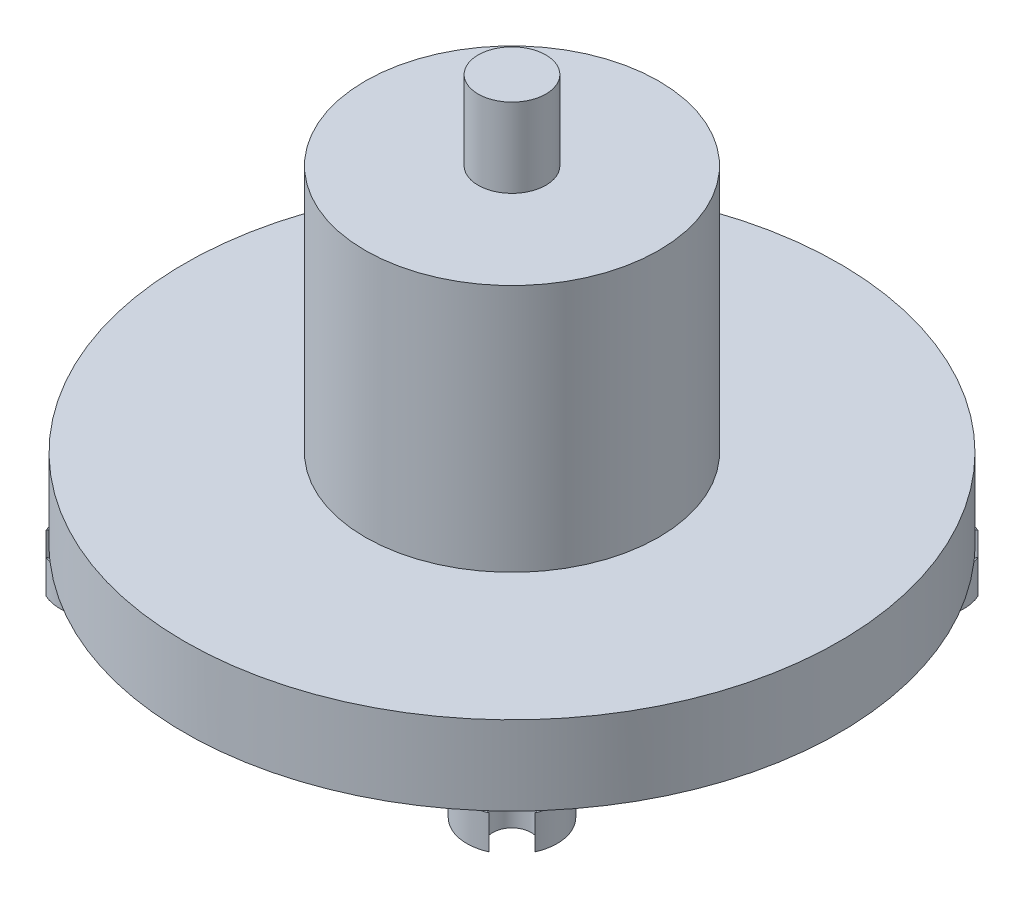
ISO-10303-21;
HEADER;
FILE_DESCRIPTION(('STEP AP214'),'2;1');
FILE_NAME('part.step','',(''),(''),'','','');
FILE_SCHEMA(('AUTOMOTIVE_DESIGN { 1 0 10303 214 1 1 1 1 }'));
ENDSEC;
DATA;
#1=APPLICATION_CONTEXT('core data for automotive mechanical design processes');
#2=APPLICATION_PROTOCOL_DEFINITION('international standard','automotive_design',2000,#1);
#3=PRODUCT_CONTEXT('',#1,'mechanical');
#4=PRODUCT('Part','Part','',(#3));
#5=PRODUCT_RELATED_PRODUCT_CATEGORY('part','',(#4));
#6=PRODUCT_DEFINITION_FORMATION('','',#4);
#7=PRODUCT_DEFINITION_CONTEXT('part definition',#1,'design');
#8=PRODUCT_DEFINITION('design','',#6,#7);
#9=PRODUCT_DEFINITION_SHAPE('','',#8);
#10=(LENGTH_UNIT() NAMED_UNIT(*) SI_UNIT(.MILLI.,.METRE.));
#11=(NAMED_UNIT(*) PLANE_ANGLE_UNIT() SI_UNIT($,.RADIAN.));
#12=(NAMED_UNIT(*) SI_UNIT($,.STERADIAN.) SOLID_ANGLE_UNIT());
#13=UNCERTAINTY_MEASURE_WITH_UNIT(LENGTH_MEASURE(1.E-05),#10,'distance_accuracy_value','');
#14=(GEOMETRIC_REPRESENTATION_CONTEXT(3) GLOBAL_UNCERTAINTY_ASSIGNED_CONTEXT((#13)) GLOBAL_UNIT_ASSIGNED_CONTEXT((#10,
#11,#12)) REPRESENTATION_CONTEXT('',''));
#15=CARTESIAN_POINT('',(0.,0.,0.));
#16=DIRECTION('',(0.,0.,1.));
#17=DIRECTION('',(1.,0.,0.));
#18=AXIS2_PLACEMENT_3D('',#15,#16,#17);
#19=CARTESIAN_POINT('',(-36.,0.,36.));
#20=DIRECTION('',(0.,1.,0.));
#21=DIRECTION('',(0.,0.,1.));
#22=AXIS2_PLACEMENT_3D('',#19,#20,#21);
#23=PLANE('',#22);
#24=CARTESIAN_POINT('',(-40.,0.,40.));
#25=DIRECTION('',(0.,1.,0.));
#26=DIRECTION('',(0.,0.,1.));
#27=AXIS2_PLACEMENT_3D('',#24,#25,#26);
#28=CIRCLE('',#27,3.4);
#29=CARTESIAN_POINT('',(-39.2408375954764,0.,43.3141624045236));
#30=VERTEX_POINT('',#29);
#31=CARTESIAN_POINT('',(-38.7454286737088,0.,43.1600713262912));
#32=VERTEX_POINT('',#31);
#33=EDGE_CURVE('E352',#30,#32,#28,.T.);
#34=ORIENTED_EDGE('',*,*,#33,.F.);
#35=CARTESIAN_POINT('',(-36.,0.,36.));
#36=DIRECTION('',(0.,1.,0.));
#37=DIRECTION('',(0.,0.,1.));
#38=AXIS2_PLACEMENT_3D('',#35,#36,#37);
#39=CIRCLE('',#38,8.);
#40=CARTESIAN_POINT('',(-38.1190982780676,0.,43.7142350552658));
#41=VERTEX_POINT('',#40);
#42=EDGE_CURVE('E216',#30,#41,#39,.T.);
#43=ORIENTED_EDGE('',*,*,#42,.T.);
#44=CARTESIAN_POINT('',(0.,0.,0.));
#45=DIRECTION('',(0.,1.,0.));
#46=DIRECTION('',(0.,0.,1.));
#47=AXIS2_PLACEMENT_3D('',#44,#45,#46);
#48=CIRCLE('',#47,58.);
#49=EDGE_CURVE('E223',#32,#41,#48,.T.);
#50=ORIENTED_EDGE('',*,*,#49,.F.);
#51=EDGE_LOOP('',(#34,#43,#50));
#52=FACE_BOUND('',#51,.T.);
#53=ADVANCED_FACE('F44',(#52),#23,.T.);
#54=CARTESIAN_POINT('',(36.,0.,-36.));
#55=DIRECTION('',(0.,1.,0.));
#56=DIRECTION('',(0.,0.,1.));
#57=AXIS2_PLACEMENT_3D('',#54,#55,#56);
#58=PLANE('',#57);
#59=CARTESIAN_POINT('',(40.,0.,-40.));
#60=DIRECTION('',(0.,1.,0.));
#61=DIRECTION('',(0.,0.,1.));
#62=AXIS2_PLACEMENT_3D('',#59,#60,#61);
#63=CIRCLE('',#62,3.4);
#64=CARTESIAN_POINT('',(43.1600713262912,0.,-38.7454286737088));
#65=VERTEX_POINT('',#64);
#66=CARTESIAN_POINT('',(43.3141624045236,0.,-39.2408375954764));
#67=VERTEX_POINT('',#66);
#68=EDGE_CURVE('E72',#65,#67,#63,.T.);
#69=ORIENTED_EDGE('',*,*,#68,.F.);
#70=CARTESIAN_POINT('',(43.7142350552657,0.,-38.1190982780676));
#71=VERTEX_POINT('',#70);
#72=EDGE_CURVE('E236',#71,#65,#48,.T.);
#73=ORIENTED_EDGE('',*,*,#72,.F.);
#74=CARTESIAN_POINT('',(36.,0.,-36.));
#75=DIRECTION('',(0.,1.,0.));
#76=DIRECTION('',(0.,0.,1.));
#77=AXIS2_PLACEMENT_3D('',#74,#75,#76);
#78=CIRCLE('',#77,8.);
#79=EDGE_CURVE('E206',#71,#67,#78,.T.);
#80=ORIENTED_EDGE('',*,*,#79,.T.);
#81=EDGE_LOOP('',(#69,#73,#80));
#82=FACE_BOUND('',#81,.T.);
#83=ADVANCED_FACE('F385',(#82),#58,.T.);
#84=CARTESIAN_POINT('',(-36.,0.,-36.));
#85=DIRECTION('',(0.,1.,0.));
#86=DIRECTION('',(0.,0.,1.));
#87=AXIS2_PLACEMENT_3D('',#84,#85,#86);
#88=PLANE('',#87);
#89=CARTESIAN_POINT('',(-40.,0.,-40.));
#90=DIRECTION('',(0.,1.,0.));
#91=DIRECTION('',(0.,0.,1.));
#92=AXIS2_PLACEMENT_3D('',#89,#90,#91);
#93=CIRCLE('',#92,3.4);
#94=CARTESIAN_POINT('',(-38.7454286737088,0.,-43.1600713262912));
#95=VERTEX_POINT('',#94);
#96=CARTESIAN_POINT('',(-39.2408375954764,0.,-43.3141624045236));
#97=VERTEX_POINT('',#96);
#98=EDGE_CURVE('E173',#95,#97,#93,.T.);
#99=ORIENTED_EDGE('',*,*,#98,.F.);
#100=CARTESIAN_POINT('',(-38.1190982780676,0.,-43.7142350552657));
#101=VERTEX_POINT('',#100);
#102=EDGE_CURVE('E246',#101,#95,#48,.T.);
#103=ORIENTED_EDGE('',*,*,#102,.F.);
#104=CARTESIAN_POINT('',(-36.,0.,-36.));
#105=DIRECTION('',(0.,1.,0.));
#106=DIRECTION('',(0.,0.,1.));
#107=AXIS2_PLACEMENT_3D('',#104,#105,#106);
#108=CIRCLE('',#107,8.);
#109=EDGE_CURVE('E186',#101,#97,#108,.T.);
#110=ORIENTED_EDGE('',*,*,#109,.T.);
#111=EDGE_LOOP('',(#99,#103,#110));
#112=FACE_BOUND('',#111,.T.);
#113=ADVANCED_FACE('F397',(#112),#88,.T.);
#114=CARTESIAN_POINT('',(36.,0.,36.));
#115=DIRECTION('',(0.,1.,0.));
#116=DIRECTION('',(0.,0.,1.));
#117=AXIS2_PLACEMENT_3D('',#114,#115,#116);
#118=PLANE('',#117);
#119=CARTESIAN_POINT('',(40.,0.,40.));
#120=DIRECTION('',(0.,1.,0.));
#121=DIRECTION('',(0.,0.,1.));
#122=AXIS2_PLACEMENT_3D('',#119,#120,#121);
#123=CIRCLE('',#122,3.4);
#124=CARTESIAN_POINT('',(43.3141624045236,0.,39.2408375954764));
#125=VERTEX_POINT('',#124);
#126=CARTESIAN_POINT('',(43.1600713262912,0.,38.7454286737088));
#127=VERTEX_POINT('',#126);
#128=EDGE_CURVE('E359',#125,#127,#123,.T.);
#129=ORIENTED_EDGE('',*,*,#128,.F.);
#130=CARTESIAN_POINT('',(36.,0.,36.));
#131=DIRECTION('',(0.,1.,0.));
#132=DIRECTION('',(0.,0.,1.));
#133=AXIS2_PLACEMENT_3D('',#130,#131,#132);
#134=CIRCLE('',#133,8.);
#135=CARTESIAN_POINT('',(43.7142350552658,0.,38.1190982780676));
#136=VERTEX_POINT('',#135);
#137=EDGE_CURVE('E181',#125,#136,#134,.T.);
#138=ORIENTED_EDGE('',*,*,#137,.T.);
#139=EDGE_CURVE('E221',#127,#136,#48,.T.);
#140=ORIENTED_EDGE('',*,*,#139,.F.);
#141=EDGE_LOOP('',(#129,#138,#140));
#142=FACE_BOUND('',#141,.T.);
#143=ADVANCED_FACE('F445',(#142),#118,.T.);
#144=CARTESIAN_POINT('',(0.,14.,0.));
#145=DIRECTION('',(0.,-1.,0.));
#146=DIRECTION('',(0.,0.,-1.));
#147=AXIS2_PLACEMENT_3D('',#144,#145,#146);
#148=CYLINDRICAL_SURFACE('',#147,58.);
#149=CARTESIAN_POINT('',(0.,14.,0.));
#150=DIRECTION('',(0.,1.,0.));
#151=DIRECTION('',(0.,0.,1.));
#152=AXIS2_PLACEMENT_3D('',#149,#150,#151);
#153=CIRCLE('',#152,58.);
#154=CARTESIAN_POINT('',(0.,14.,58.));
#155=VERTEX_POINT('',#154);
#156=EDGE_CURVE('E217',#155,#155,#153,.T.);
#157=ORIENTED_EDGE('',*,*,#156,.F.);
#158=EDGE_LOOP('',(#157));
#159=FACE_BOUND('',#158,.T.);
#160=CARTESIAN_POINT('',(38.1190982780676,0.,43.7142350552657));
#161=VERTEX_POINT('',#160);
#162=CARTESIAN_POINT('',(38.7454286737088,0.,43.1600713262912));
#163=VERTEX_POINT('',#162);
#164=EDGE_CURVE('E222',#161,#163,#48,.T.);
#165=ORIENTED_EDGE('',*,*,#164,.T.);
#166=EDGE_CURVE('E183',#163,#127,#48,.T.);
#167=ORIENTED_EDGE('',*,*,#166,.T.);
#168=ORIENTED_EDGE('',*,*,#139,.T.);
#169=EDGE_CURVE('E227',#136,#71,#48,.T.);
#170=ORIENTED_EDGE('',*,*,#169,.T.);
#171=ORIENTED_EDGE('',*,*,#72,.T.);
#172=CARTESIAN_POINT('',(38.7454286737088,0.,-43.1600713262912));
#173=VERTEX_POINT('',#172);
#174=EDGE_CURVE('E250',#65,#173,#48,.T.);
#175=ORIENTED_EDGE('',*,*,#174,.T.);
#176=CARTESIAN_POINT('',(38.1190982780676,0.,-43.7142350552658));
#177=VERTEX_POINT('',#176);
#178=EDGE_CURVE('E245',#173,#177,#48,.T.);
#179=ORIENTED_EDGE('',*,*,#178,.T.);
#180=EDGE_CURVE('E244',#177,#101,#48,.T.);
#181=ORIENTED_EDGE('',*,*,#180,.T.);
#182=ORIENTED_EDGE('',*,*,#102,.T.);
#183=CARTESIAN_POINT('',(-43.1600713262912,0.,-38.7454286737088));
#184=VERTEX_POINT('',#183);
#185=EDGE_CURVE('E235',#95,#184,#48,.T.);
#186=ORIENTED_EDGE('',*,*,#185,.T.);
#187=CARTESIAN_POINT('',(-43.7142350552658,0.,-38.1190982780676));
#188=VERTEX_POINT('',#187);
#189=EDGE_CURVE('E255',#184,#188,#48,.T.);
#190=ORIENTED_EDGE('',*,*,#189,.T.);
#191=CARTESIAN_POINT('',(-43.7142350552657,0.,38.1190982780676));
#192=VERTEX_POINT('',#191);
#193=EDGE_CURVE('E254',#188,#192,#48,.T.);
#194=ORIENTED_EDGE('',*,*,#193,.T.);
#195=CARTESIAN_POINT('',(-43.1600713262912,0.,38.7454286737088));
#196=VERTEX_POINT('',#195);
#197=EDGE_CURVE('E234',#192,#196,#48,.T.);
#198=ORIENTED_EDGE('',*,*,#197,.T.);
#199=EDGE_CURVE('E231',#196,#32,#48,.T.);
#200=ORIENTED_EDGE('',*,*,#199,.T.);
#201=ORIENTED_EDGE('',*,*,#49,.T.);
#202=EDGE_CURVE('E211',#41,#161,#48,.T.);
#203=ORIENTED_EDGE('',*,*,#202,.T.);
#204=EDGE_LOOP('',(#165,#167,#168,#170,#171,#175,#179,#181,#182,#186,#190,#194,#198,#200,#201,#203));
#205=FACE_BOUND('',#204,.T.);
#206=ADVANCED_FACE('F50',(#159,#205),#148,.T.);
#207=CARTESIAN_POINT('',(0.,14.,0.));
#208=DIRECTION('',(0.,1.,0.));
#209=DIRECTION('',(0.,0.,1.));
#210=AXIS2_PLACEMENT_3D('',#207,#208,#209);
#211=PLANE('',#210);
#212=CARTESIAN_POINT('',(0.,14.,0.));
#213=DIRECTION('',(0.,1.,0.));
#214=DIRECTION('',(0.,0.,1.));
#215=AXIS2_PLACEMENT_3D('',#212,#213,#214);
#216=CIRCLE('',#215,26.);
#217=CARTESIAN_POINT('',(0.,14.,-26.));
#218=VERTEX_POINT('',#217);
#219=EDGE_CURVE('E298',#218,#218,#216,.F.);
#220=ORIENTED_EDGE('',*,*,#219,.T.);
#221=EDGE_LOOP('',(#220));
#222=FACE_BOUND('',#221,.T.);
#223=ORIENTED_EDGE('',*,*,#156,.T.);
#224=EDGE_LOOP('',(#223));
#225=FACE_BOUND('',#224,.T.);
#226=ADVANCED_FACE('F423',(#222,#225),#211,.T.);
#227=CARTESIAN_POINT('',(0.,0.,0.));
#228=DIRECTION('',(0.,1.,0.));
#229=DIRECTION('',(0.,0.,1.));
#230=AXIS2_PLACEMENT_3D('',#227,#228,#229);
#231=PLANE('',#230);
#232=ORIENTED_EDGE('',*,*,#169,.F.);
#233=EDGE_CURVE('E191',#136,#161,#134,.T.);
#234=ORIENTED_EDGE('',*,*,#233,.T.);
#235=ORIENTED_EDGE('',*,*,#202,.F.);
#236=EDGE_CURVE('E220',#41,#192,#39,.T.);
#237=ORIENTED_EDGE('',*,*,#236,.T.);
#238=ORIENTED_EDGE('',*,*,#193,.F.);
#239=EDGE_CURVE('E200',#188,#101,#108,.T.);
#240=ORIENTED_EDGE('',*,*,#239,.T.);
#241=ORIENTED_EDGE('',*,*,#180,.F.);
#242=EDGE_CURVE('E306',#177,#71,#78,.T.);
#243=ORIENTED_EDGE('',*,*,#242,.T.);
#244=EDGE_LOOP('',(#232,#234,#235,#237,#238,#240,#241,#243));
#245=FACE_BOUND('',#244,.T.);
#246=ADVANCED_FACE('F415',(#245),#231,.F.);
#247=CARTESIAN_POINT('',(-43.3141624045236,0.,39.2408375954764));
#248=VERTEX_POINT('',#247);
#249=EDGE_CURVE('E64',#196,#248,#28,.T.);
#250=ORIENTED_EDGE('',*,*,#249,.F.);
#251=ORIENTED_EDGE('',*,*,#197,.F.);
#252=EDGE_CURVE('E215',#192,#248,#39,.T.);
#253=ORIENTED_EDGE('',*,*,#252,.T.);
#254=EDGE_LOOP('',(#250,#251,#253));
#255=FACE_BOUND('',#254,.T.);
#256=ADVANCED_FACE('F401',(#255),#23,.T.);
#257=CARTESIAN_POINT('',(-36.,-6.,36.));
#258=DIRECTION('',(0.,1.,0.));
#259=DIRECTION('',(0.,0.,1.));
#260=AXIS2_PLACEMENT_3D('',#257,#258,#259);
#261=CYLINDRICAL_SURFACE('',#260,8.);
#262=DIRECTION('',(0.,1.,0.));
#263=VECTOR('',#262,1.);
#264=CARTESIAN_POINT('',(-39.2408375954764,-3.,43.3141624045236));
#265=LINE('',#264,#263);
#266=CARTESIAN_POINT('',(-39.2408375954764,-6.,43.3141624045236));
#267=VERTEX_POINT('',#266);
#268=EDGE_CURVE('E289',#267,#30,#265,.T.);
#269=ORIENTED_EDGE('',*,*,#268,.F.);
#270=CARTESIAN_POINT('',(-36.,-6.,36.));
#271=DIRECTION('',(0.,1.,0.));
#272=DIRECTION('',(0.,0.,1.));
#273=AXIS2_PLACEMENT_3D('',#270,#271,#272);
#274=CIRCLE('',#273,8.);
#275=CARTESIAN_POINT('',(-43.3141624045236,-6.,39.2408375954764));
#276=VERTEX_POINT('',#275);
#277=EDGE_CURVE('E210',#267,#276,#274,.T.);
#278=ORIENTED_EDGE('',*,*,#277,.T.);
#279=DIRECTION('',(0.,1.,0.));
#280=VECTOR('',#279,1.);
#281=CARTESIAN_POINT('',(-43.3141624045236,-3.,39.2408375954764));
#282=LINE('',#281,#280);
#283=EDGE_CURVE('E287',#248,#276,#282,.F.);
#284=ORIENTED_EDGE('',*,*,#283,.F.);
#285=ORIENTED_EDGE('',*,*,#252,.F.);
#286=ORIENTED_EDGE('',*,*,#236,.F.);
#287=ORIENTED_EDGE('',*,*,#42,.F.);
#288=EDGE_LOOP('',(#269,#278,#284,#285,#286,#287));
#289=FACE_BOUND('',#288,.T.);
#290=ADVANCED_FACE('F412',(#289),#261,.T.);
#291=CARTESIAN_POINT('',(-36.,-6.,36.));
#292=DIRECTION('',(0.,1.,0.));
#293=DIRECTION('',(0.,0.,1.));
#294=AXIS2_PLACEMENT_3D('',#291,#292,#293);
#295=PLANE('',#294);
#296=ORIENTED_EDGE('',*,*,#277,.F.);
#297=CARTESIAN_POINT('',(-40.,-6.,40.));
#298=DIRECTION('',(0.,1.,0.));
#299=DIRECTION('',(0.,0.,1.));
#300=AXIS2_PLACEMENT_3D('',#297,#298,#299);
#301=CIRCLE('',#300,3.4);
#302=EDGE_CURVE('E350',#267,#276,#301,.T.);
#303=ORIENTED_EDGE('',*,*,#302,.T.);
#304=EDGE_LOOP('',(#296,#303));
#305=FACE_BOUND('',#304,.T.);
#306=ADVANCED_FACE('F416',(#305),#295,.F.);
#307=CARTESIAN_POINT('',(39.2408375954764,0.,-43.3141624045236));
#308=VERTEX_POINT('',#307);
#309=EDGE_CURVE('E372',#308,#173,#63,.T.);
#310=ORIENTED_EDGE('',*,*,#309,.F.);
#311=EDGE_CURVE('E307',#308,#177,#78,.T.);
#312=ORIENTED_EDGE('',*,*,#311,.T.);
#313=ORIENTED_EDGE('',*,*,#178,.F.);
#314=EDGE_LOOP('',(#310,#312,#313));
#315=FACE_BOUND('',#314,.T.);
#316=ADVANCED_FACE('F400',(#315),#58,.T.);
#317=CARTESIAN_POINT('',(36.,-6.,-36.));
#318=DIRECTION('',(0.,1.,0.));
#319=DIRECTION('',(0.,0.,1.));
#320=AXIS2_PLACEMENT_3D('',#317,#318,#319);
#321=CYLINDRICAL_SURFACE('',#320,8.);
#322=DIRECTION('',(0.,1.,0.));
#323=VECTOR('',#322,1.);
#324=CARTESIAN_POINT('',(39.2408375954764,-3.,-43.3141624045236));
#325=LINE('',#324,#323);
#326=CARTESIAN_POINT('',(39.2408375954764,-6.,-43.3141624045236));
#327=VERTEX_POINT('',#326);
#328=EDGE_CURVE('E284',#327,#308,#325,.T.);
#329=ORIENTED_EDGE('',*,*,#328,.F.);
#330=CARTESIAN_POINT('',(36.,-6.,-36.));
#331=DIRECTION('',(0.,1.,0.));
#332=DIRECTION('',(0.,0.,1.));
#333=AXIS2_PLACEMENT_3D('',#330,#331,#332);
#334=CIRCLE('',#333,8.);
#335=CARTESIAN_POINT('',(43.3141624045236,-6.,-39.2408375954764));
#336=VERTEX_POINT('',#335);
#337=EDGE_CURVE('E304',#327,#336,#334,.T.);
#338=ORIENTED_EDGE('',*,*,#337,.T.);
#339=DIRECTION('',(0.,1.,0.));
#340=VECTOR('',#339,1.);
#341=CARTESIAN_POINT('',(43.3141624045236,-3.,-39.2408375954764));
#342=LINE('',#341,#340);
#343=EDGE_CURVE('E278',#67,#336,#342,.F.);
#344=ORIENTED_EDGE('',*,*,#343,.F.);
#345=ORIENTED_EDGE('',*,*,#79,.F.);
#346=ORIENTED_EDGE('',*,*,#242,.F.);
#347=ORIENTED_EDGE('',*,*,#311,.F.);
#348=EDGE_LOOP('',(#329,#338,#344,#345,#346,#347));
#349=FACE_BOUND('',#348,.T.);
#350=ADVANCED_FACE('F382',(#349),#321,.T.);
#351=CARTESIAN_POINT('',(36.,-6.,-36.));
#352=DIRECTION('',(0.,1.,0.));
#353=DIRECTION('',(0.,0.,1.));
#354=AXIS2_PLACEMENT_3D('',#351,#352,#353);
#355=PLANE('',#354);
#356=ORIENTED_EDGE('',*,*,#337,.F.);
#357=CARTESIAN_POINT('',(40.,-6.,-40.));
#358=DIRECTION('',(0.,1.,0.));
#359=DIRECTION('',(0.,0.,1.));
#360=AXIS2_PLACEMENT_3D('',#357,#358,#359);
#361=CIRCLE('',#360,3.4);
#362=EDGE_CURVE('E11',#327,#336,#361,.T.);
#363=ORIENTED_EDGE('',*,*,#362,.T.);
#364=EDGE_LOOP('',(#356,#363));
#365=FACE_BOUND('',#364,.T.);
#366=ADVANCED_FACE('F384',(#365),#355,.F.);
#367=CARTESIAN_POINT('',(-43.3141624045236,0.,-39.2408375954764));
#368=VERTEX_POINT('',#367);
#369=EDGE_CURVE('E370',#368,#184,#93,.T.);
#370=ORIENTED_EDGE('',*,*,#369,.F.);
#371=EDGE_CURVE('E197',#368,#188,#108,.T.);
#372=ORIENTED_EDGE('',*,*,#371,.T.);
#373=ORIENTED_EDGE('',*,*,#189,.F.);
#374=EDGE_LOOP('',(#370,#372,#373));
#375=FACE_BOUND('',#374,.T.);
#376=ADVANCED_FACE('F390',(#375),#88,.T.);
#377=CARTESIAN_POINT('',(-36.,-6.,-36.));
#378=DIRECTION('',(0.,1.,0.));
#379=DIRECTION('',(0.,0.,1.));
#380=AXIS2_PLACEMENT_3D('',#377,#378,#379);
#381=CYLINDRICAL_SURFACE('',#380,8.);
#382=DIRECTION('',(0.,1.,0.));
#383=VECTOR('',#382,1.);
#384=CARTESIAN_POINT('',(-43.3141624045236,-3.,-39.2408375954764));
#385=LINE('',#384,#383);
#386=CARTESIAN_POINT('',(-43.3141624045236,-6.,-39.2408375954764));
#387=VERTEX_POINT('',#386);
#388=EDGE_CURVE('E271',#387,#368,#385,.T.);
#389=ORIENTED_EDGE('',*,*,#388,.F.);
#390=CARTESIAN_POINT('',(-36.,-6.,-36.));
#391=DIRECTION('',(0.,1.,0.));
#392=DIRECTION('',(0.,0.,1.));
#393=AXIS2_PLACEMENT_3D('',#390,#391,#392);
#394=CIRCLE('',#393,8.);
#395=CARTESIAN_POINT('',(-39.2408375954764,-6.,-43.3141624045236));
#396=VERTEX_POINT('',#395);
#397=EDGE_CURVE('E205',#387,#396,#394,.T.);
#398=ORIENTED_EDGE('',*,*,#397,.T.);
#399=DIRECTION('',(0.,1.,0.));
#400=VECTOR('',#399,1.);
#401=CARTESIAN_POINT('',(-39.2408375954764,-3.,-43.3141624045236));
#402=LINE('',#401,#400);
#403=EDGE_CURVE('E267',#97,#396,#402,.F.);
#404=ORIENTED_EDGE('',*,*,#403,.F.);
#405=ORIENTED_EDGE('',*,*,#109,.F.);
#406=ORIENTED_EDGE('',*,*,#239,.F.);
#407=ORIENTED_EDGE('',*,*,#371,.F.);
#408=EDGE_LOOP('',(#389,#398,#404,#405,#406,#407));
#409=FACE_BOUND('',#408,.T.);
#410=ADVANCED_FACE('F394',(#409),#381,.T.);
#411=CARTESIAN_POINT('',(-36.,-6.,-36.));
#412=DIRECTION('',(0.,1.,0.));
#413=DIRECTION('',(0.,0.,1.));
#414=AXIS2_PLACEMENT_3D('',#411,#412,#413);
#415=PLANE('',#414);
#416=ORIENTED_EDGE('',*,*,#397,.F.);
#417=CARTESIAN_POINT('',(-40.,-6.,-40.));
#418=DIRECTION('',(0.,1.,0.));
#419=DIRECTION('',(0.,0.,1.));
#420=AXIS2_PLACEMENT_3D('',#417,#418,#419);
#421=CIRCLE('',#420,3.4);
#422=EDGE_CURVE('E54',#387,#396,#421,.T.);
#423=ORIENTED_EDGE('',*,*,#422,.T.);
#424=EDGE_LOOP('',(#416,#423));
#425=FACE_BOUND('',#424,.T.);
#426=ADVANCED_FACE('F431',(#425),#415,.F.);
#427=CARTESIAN_POINT('',(39.2408375954764,0.,43.3141624045236));
#428=VERTEX_POINT('',#427);
#429=EDGE_CURVE('E171',#163,#428,#123,.T.);
#430=ORIENTED_EDGE('',*,*,#429,.F.);
#431=ORIENTED_EDGE('',*,*,#164,.F.);
#432=EDGE_CURVE('E193',#161,#428,#134,.T.);
#433=ORIENTED_EDGE('',*,*,#432,.T.);
#434=EDGE_LOOP('',(#430,#431,#433));
#435=FACE_BOUND('',#434,.T.);
#436=ADVANCED_FACE('F433',(#435),#118,.T.);
#437=CARTESIAN_POINT('',(36.,-6.,36.));
#438=DIRECTION('',(0.,1.,0.));
#439=DIRECTION('',(0.,0.,1.));
#440=AXIS2_PLACEMENT_3D('',#437,#438,#439);
#441=CYLINDRICAL_SURFACE('',#440,8.);
#442=DIRECTION('',(0.,1.,0.));
#443=VECTOR('',#442,1.);
#444=CARTESIAN_POINT('',(43.3141624045236,-3.,39.2408375954764));
#445=LINE('',#444,#443);
#446=CARTESIAN_POINT('',(43.3141624045236,-6.,39.2408375954764));
#447=VERTEX_POINT('',#446);
#448=EDGE_CURVE('E167',#447,#125,#445,.T.);
#449=ORIENTED_EDGE('',*,*,#448,.F.);
#450=CARTESIAN_POINT('',(36.,-6.,36.));
#451=DIRECTION('',(0.,1.,0.));
#452=DIRECTION('',(0.,0.,1.));
#453=AXIS2_PLACEMENT_3D('',#450,#451,#452);
#454=CIRCLE('',#453,8.);
#455=CARTESIAN_POINT('',(39.2408375954764,-6.,43.3141624045236));
#456=VERTEX_POINT('',#455);
#457=EDGE_CURVE('E176',#447,#456,#454,.T.);
#458=ORIENTED_EDGE('',*,*,#457,.T.);
#459=DIRECTION('',(0.,1.,0.));
#460=VECTOR('',#459,1.);
#461=CARTESIAN_POINT('',(39.2408375954764,-3.,43.3141624045236));
#462=LINE('',#461,#460);
#463=EDGE_CURVE('E166',#428,#456,#462,.F.);
#464=ORIENTED_EDGE('',*,*,#463,.F.);
#465=ORIENTED_EDGE('',*,*,#432,.F.);
#466=ORIENTED_EDGE('',*,*,#233,.F.);
#467=ORIENTED_EDGE('',*,*,#137,.F.);
#468=EDGE_LOOP('',(#449,#458,#464,#465,#466,#467));
#469=FACE_BOUND('',#468,.T.);
#470=ADVANCED_FACE('F179',(#469),#441,.T.);
#471=CARTESIAN_POINT('',(36.,-6.,36.));
#472=DIRECTION('',(0.,1.,0.));
#473=DIRECTION('',(0.,0.,1.));
#474=AXIS2_PLACEMENT_3D('',#471,#472,#473);
#475=PLANE('',#474);
#476=ORIENTED_EDGE('',*,*,#457,.F.);
#477=CARTESIAN_POINT('',(40.,-6.,40.));
#478=DIRECTION('',(0.,1.,0.));
#479=DIRECTION('',(0.,0.,1.));
#480=AXIS2_PLACEMENT_3D('',#477,#478,#479);
#481=CIRCLE('',#480,3.4);
#482=EDGE_CURVE('E165',#447,#456,#481,.T.);
#483=ORIENTED_EDGE('',*,*,#482,.T.);
#484=EDGE_LOOP('',(#476,#483));
#485=FACE_BOUND('',#484,.T.);
#486=ADVANCED_FACE('F190',(#485),#475,.F.);
#487=CARTESIAN_POINT('',(0.,58.,0.));
#488=DIRECTION('',(0.,-1.,0.));
#489=DIRECTION('',(0.,0.,-1.));
#490=AXIS2_PLACEMENT_3D('',#487,#488,#489);
#491=CYLINDRICAL_SURFACE('',#490,26.);
#492=CARTESIAN_POINT('',(0.,58.,0.));
#493=DIRECTION('',(0.,1.,0.));
#494=DIRECTION('',(0.,0.,1.));
#495=AXIS2_PLACEMENT_3D('',#492,#493,#494);
#496=CIRCLE('',#495,26.);
#497=CARTESIAN_POINT('',(0.,58.,-26.));
#498=VERTEX_POINT('',#497);
#499=EDGE_CURVE('E297',#498,#498,#496,.T.);
#500=CARTESIAN_POINT('',(0.,14.,-26.));
#501=CARTESIAN_POINT('',(0.,14.4583333333333,-26.));
#502=CARTESIAN_POINT('',(0.,14.9166666666667,-26.));
#503=CARTESIAN_POINT('',(0.,15.8333333333333,-26.));
#504=CARTESIAN_POINT('',(0.,16.2916666666667,-26.));
#505=CARTESIAN_POINT('',(0.,17.2083333333333,-26.));
#506=CARTESIAN_POINT('',(0.,17.6666666666667,-26.));
#507=CARTESIAN_POINT('',(0.,18.5833333333333,-26.));
#508=CARTESIAN_POINT('',(0.,19.0416666666667,-26.));
#509=CARTESIAN_POINT('',(0.,19.9583333333333,-26.));
#510=CARTESIAN_POINT('',(0.,20.4166666666667,-26.));
#511=CARTESIAN_POINT('',(0.,21.3333333333333,-26.));
#512=CARTESIAN_POINT('',(0.,21.7916666666667,-26.));
#513=CARTESIAN_POINT('',(0.,22.7083333333333,-26.));
#514=CARTESIAN_POINT('',(0.,23.1666666666667,-26.));
#515=CARTESIAN_POINT('',(0.,24.0833333333333,-26.));
#516=CARTESIAN_POINT('',(0.,24.5416666666667,-26.));
#517=CARTESIAN_POINT('',(0.,25.4583333333333,-26.));
#518=CARTESIAN_POINT('',(0.,25.9166666666667,-26.));
#519=CARTESIAN_POINT('',(0.,26.8333333333333,-26.));
#520=CARTESIAN_POINT('',(0.,27.2916666666667,-26.));
#521=CARTESIAN_POINT('',(0.,28.2083333333333,-26.));
#522=CARTESIAN_POINT('',(0.,28.6666666666667,-26.));
#523=CARTESIAN_POINT('',(0.,29.5833333333333,-26.));
#524=CARTESIAN_POINT('',(0.,30.0416666666667,-26.));
#525=CARTESIAN_POINT('',(0.,30.9583333333333,-26.));
#526=CARTESIAN_POINT('',(0.,31.4166666666667,-26.));
#527=CARTESIAN_POINT('',(0.,32.3333333333333,-26.));
#528=CARTESIAN_POINT('',(0.,32.7916666666667,-26.));
#529=CARTESIAN_POINT('',(0.,33.7083333333333,-26.));
#530=CARTESIAN_POINT('',(0.,34.1666666666667,-26.));
#531=CARTESIAN_POINT('',(0.,35.0833333333333,-26.));
#532=CARTESIAN_POINT('',(0.,35.5416666666667,-26.));
#533=CARTESIAN_POINT('',(0.,36.4583333333333,-26.));
#534=CARTESIAN_POINT('',(0.,36.9166666666667,-26.));
#535=CARTESIAN_POINT('',(0.,37.8333333333333,-26.));
#536=CARTESIAN_POINT('',(0.,38.2916666666667,-26.));
#537=CARTESIAN_POINT('',(0.,39.2083333333333,-26.));
#538=CARTESIAN_POINT('',(0.,39.6666666666667,-26.));
#539=CARTESIAN_POINT('',(0.,40.5833333333333,-26.));
#540=CARTESIAN_POINT('',(0.,41.0416666666667,-26.));
#541=CARTESIAN_POINT('',(0.,41.9583333333333,-26.));
#542=CARTESIAN_POINT('',(0.,42.4166666666667,-26.));
#543=CARTESIAN_POINT('',(0.,43.3333333333333,-26.));
#544=CARTESIAN_POINT('',(0.,43.7916666666667,-26.));
#545=CARTESIAN_POINT('',(0.,44.7083333333333,-26.));
#546=CARTESIAN_POINT('',(0.,45.1666666666667,-26.));
#547=CARTESIAN_POINT('',(0.,46.0833333333333,-26.));
#548=CARTESIAN_POINT('',(0.,46.5416666666667,-26.));
#549=CARTESIAN_POINT('',(0.,47.4583333333333,-26.));
#550=CARTESIAN_POINT('',(0.,47.9166666666667,-26.));
#551=CARTESIAN_POINT('',(0.,48.8333333333333,-26.));
#552=CARTESIAN_POINT('',(0.,49.2916666666667,-26.));
#553=CARTESIAN_POINT('',(0.,50.2083333333333,-26.));
#554=CARTESIAN_POINT('',(0.,50.6666666666667,-26.));
#555=CARTESIAN_POINT('',(0.,51.5833333333333,-26.));
#556=CARTESIAN_POINT('',(0.,52.0416666666667,-26.));
#557=CARTESIAN_POINT('',(0.,52.9583333333333,-26.));
#558=CARTESIAN_POINT('',(0.,53.4166666666667,-26.));
#559=CARTESIAN_POINT('',(0.,54.3333333333333,-26.));
#560=CARTESIAN_POINT('',(0.,54.7916666666667,-26.));
#561=CARTESIAN_POINT('',(0.,55.7083333333333,-26.));
#562=CARTESIAN_POINT('',(0.,56.1666666666667,-26.));
#563=CARTESIAN_POINT('',(0.,57.0833333333333,-26.));
#564=CARTESIAN_POINT('',(0.,57.5416666666667,-26.));
#565=CARTESIAN_POINT('',(0.,58.,-26.));
#566=B_SPLINE_CURVE_WITH_KNOTS('',3,(#500,#501,#502,#503,#504,#505,#506,#507,#508,#509,#510,
#511,#512,#513,#514,#515,#516,#517,#518,#519,#520,#521,#522,#523,#524,#525,#526,#527,#528,#529,
#530,#531,#532,#533,#534,#535,#536,#537,#538,#539,#540,#541,#542,#543,#544,#545,#546,#547,#548,
#549,#550,#551,#552,#553,#554,#555,#556,#557,#558,#559,#560,#561,#562,#563,#564,#565),
.UNSPECIFIED.,.F.,.F.,(4,2,2,2,2,2,2,2,2,2,2,2,2,2,2,2,2,2,2,2,2,2,2,2,2,2,2,2,2,2,2,2,4),(0.,
1.375,2.75,4.125,5.50000000000001,6.875,8.25,9.625,11.,12.375,13.75,15.125,16.5,17.875,19.25,
20.625,22.,23.375,24.75,26.125,27.5,28.875,30.25,31.625,33.,34.375,35.75,37.125,38.5,39.875,
41.25,42.625,44.),.UNSPECIFIED.);
#567=EDGE_CURVE('BSEAM439',#218,#498,#566,.T.);
#568=ORIENTED_EDGE('',*,*,#219,.F.);
#569=ORIENTED_EDGE('',*,*,#499,.F.);
#570=ORIENTED_EDGE('',*,*,#567,.T.);
#571=ORIENTED_EDGE('',*,*,#567,.F.);
#572=EDGE_LOOP('',(#568,#570,#569,#571));
#573=FACE_BOUND('',#572,.T.);
#574=ADVANCED_FACE('F439',(#573),#491,.T.);
#575=CARTESIAN_POINT('',(0.,58.,0.));
#576=DIRECTION('',(0.,1.,0.));
#577=DIRECTION('',(0.,0.,1.));
#578=AXIS2_PLACEMENT_3D('',#575,#576,#577);
#579=PLANE('',#578);
#580=CARTESIAN_POINT('',(0.,58.,0.));
#581=DIRECTION('',(0.,1.,0.));
#582=DIRECTION('',(0.,0.,1.));
#583=AXIS2_PLACEMENT_3D('',#580,#581,#582);
#584=CIRCLE('',#583,6.);
#585=CARTESIAN_POINT('',(0.,58.,6.));
#586=VERTEX_POINT('',#585);
#587=EDGE_CURVE('E47',#586,#586,#584,.F.);
#588=ORIENTED_EDGE('',*,*,#587,.T.);
#589=EDGE_LOOP('',(#588));
#590=FACE_BOUND('',#589,.T.);
#591=ORIENTED_EDGE('',*,*,#499,.T.);
#592=EDGE_LOOP('',(#591));
#593=FACE_BOUND('',#592,.T.);
#594=ADVANCED_FACE('F569',(#590,#593),#579,.T.);
#595=CARTESIAN_POINT('',(0.,72.,0.));
#596=DIRECTION('',(0.,-1.,0.));
#597=DIRECTION('',(0.,0.,-1.));
#598=AXIS2_PLACEMENT_3D('',#595,#596,#597);
#599=CYLINDRICAL_SURFACE('',#598,6.);
#600=ORIENTED_EDGE('',*,*,#587,.F.);
#601=EDGE_LOOP('',(#600));
#602=FACE_BOUND('',#601,.T.);
#603=CARTESIAN_POINT('',(0.,72.,0.));
#604=DIRECTION('',(0.,1.,0.));
#605=DIRECTION('',(0.,0.,1.));
#606=AXIS2_PLACEMENT_3D('',#603,#604,#605);
#607=CIRCLE('',#606,6.);
#608=CARTESIAN_POINT('',(0.,72.,6.));
#609=VERTEX_POINT('',#608);
#610=EDGE_CURVE('E295',#609,#609,#607,.T.);
#611=ORIENTED_EDGE('',*,*,#610,.F.);
#612=EDGE_LOOP('',(#611));
#613=FACE_BOUND('',#612,.T.);
#614=ADVANCED_FACE('F558',(#602,#613),#599,.T.);
#615=CARTESIAN_POINT('',(0.,72.,0.));
#616=DIRECTION('',(0.,1.,0.));
#617=DIRECTION('',(0.,0.,1.));
#618=AXIS2_PLACEMENT_3D('',#615,#616,#617);
#619=PLANE('',#618);
#620=ORIENTED_EDGE('',*,*,#610,.T.);
#621=EDGE_LOOP('',(#620));
#622=FACE_BOUND('',#621,.T.);
#623=ADVANCED_FACE('F465',(#622),#619,.T.);
#624=CARTESIAN_POINT('',(40.,0.,40.));
#625=DIRECTION('',(0.,1.,0.));
#626=DIRECTION('',(0.,0.,1.));
#627=AXIS2_PLACEMENT_3D('',#624,#625,#626);
#628=PLANE('',#627);
#629=EDGE_CURVE('E363',#127,#163,#123,.T.);
#630=ORIENTED_EDGE('',*,*,#629,.F.);
#631=ORIENTED_EDGE('',*,*,#166,.F.);
#632=EDGE_LOOP('',(#630,#631));
#633=FACE_BOUND('',#632,.T.);
#634=ADVANCED_FACE('F456',(#633),#628,.F.);
#635=CARTESIAN_POINT('',(40.,-6.,40.));
#636=DIRECTION('',(0.,1.,0.));
#637=DIRECTION('',(0.,0.,1.));
#638=AXIS2_PLACEMENT_3D('',#635,#636,#637);
#639=CYLINDRICAL_SURFACE('',#638,3.4);
#640=ORIENTED_EDGE('',*,*,#448,.T.);
#641=ORIENTED_EDGE('',*,*,#128,.T.);
#642=ORIENTED_EDGE('',*,*,#629,.T.);
#643=ORIENTED_EDGE('',*,*,#429,.T.);
#644=ORIENTED_EDGE('',*,*,#463,.T.);
#645=ORIENTED_EDGE('',*,*,#482,.F.);
#646=EDGE_LOOP('',(#640,#641,#642,#643,#644,#645));
#647=FACE_BOUND('',#646,.T.);
#648=ADVANCED_FACE('F163',(#647),#639,.F.);
#649=CARTESIAN_POINT('',(-40.,0.,-40.));
#650=DIRECTION('',(0.,1.,0.));
#651=DIRECTION('',(0.,0.,1.));
#652=AXIS2_PLACEMENT_3D('',#649,#650,#651);
#653=PLANE('',#652);
#654=EDGE_CURVE('E366',#184,#95,#93,.T.);
#655=ORIENTED_EDGE('',*,*,#654,.F.);
#656=ORIENTED_EDGE('',*,*,#185,.F.);
#657=EDGE_LOOP('',(#655,#656));
#658=FACE_BOUND('',#657,.T.);
#659=ADVANCED_FACE('F472',(#658),#653,.F.);
#660=CARTESIAN_POINT('',(-40.,-6.,-40.));
#661=DIRECTION('',(0.,1.,0.));
#662=DIRECTION('',(0.,0.,1.));
#663=AXIS2_PLACEMENT_3D('',#660,#661,#662);
#664=CYLINDRICAL_SURFACE('',#663,3.4);
#665=ORIENTED_EDGE('',*,*,#388,.T.);
#666=ORIENTED_EDGE('',*,*,#369,.T.);
#667=ORIENTED_EDGE('',*,*,#654,.T.);
#668=ORIENTED_EDGE('',*,*,#98,.T.);
#669=ORIENTED_EDGE('',*,*,#403,.T.);
#670=ORIENTED_EDGE('',*,*,#422,.F.);
#671=EDGE_LOOP('',(#665,#666,#667,#668,#669,#670));
#672=FACE_BOUND('',#671,.T.);
#673=ADVANCED_FACE('F477',(#672),#664,.F.);
#674=CARTESIAN_POINT('',(40.,0.,-40.));
#675=DIRECTION('',(0.,1.,0.));
#676=DIRECTION('',(0.,0.,1.));
#677=AXIS2_PLACEMENT_3D('',#674,#675,#676);
#678=PLANE('',#677);
#679=EDGE_CURVE('E376',#173,#65,#63,.T.);
#680=ORIENTED_EDGE('',*,*,#679,.F.);
#681=ORIENTED_EDGE('',*,*,#174,.F.);
#682=EDGE_LOOP('',(#680,#681));
#683=FACE_BOUND('',#682,.T.);
#684=ADVANCED_FACE('F487',(#683),#678,.F.);
#685=CARTESIAN_POINT('',(40.,-6.,-40.));
#686=DIRECTION('',(0.,1.,0.));
#687=DIRECTION('',(0.,0.,1.));
#688=AXIS2_PLACEMENT_3D('',#685,#686,#687);
#689=CYLINDRICAL_SURFACE('',#688,3.4);
#690=ORIENTED_EDGE('',*,*,#328,.T.);
#691=ORIENTED_EDGE('',*,*,#309,.T.);
#692=ORIENTED_EDGE('',*,*,#679,.T.);
#693=ORIENTED_EDGE('',*,*,#68,.T.);
#694=ORIENTED_EDGE('',*,*,#343,.T.);
#695=ORIENTED_EDGE('',*,*,#362,.F.);
#696=EDGE_LOOP('',(#690,#691,#692,#693,#694,#695));
#697=FACE_BOUND('',#696,.T.);
#698=ADVANCED_FACE('F377',(#697),#689,.F.);
#699=CARTESIAN_POINT('',(-40.,0.,40.));
#700=DIRECTION('',(0.,1.,0.));
#701=DIRECTION('',(0.,0.,1.));
#702=AXIS2_PLACEMENT_3D('',#699,#700,#701);
#703=PLANE('',#702);
#704=EDGE_CURVE('E351',#32,#196,#28,.T.);
#705=ORIENTED_EDGE('',*,*,#704,.F.);
#706=ORIENTED_EDGE('',*,*,#199,.F.);
#707=EDGE_LOOP('',(#705,#706));
#708=FACE_BOUND('',#707,.T.);
#709=ADVANCED_FACE('F501',(#708),#703,.F.);
#710=CARTESIAN_POINT('',(-40.,-6.,40.));
#711=DIRECTION('',(0.,1.,0.));
#712=DIRECTION('',(0.,0.,1.));
#713=AXIS2_PLACEMENT_3D('',#710,#711,#712);
#714=CYLINDRICAL_SURFACE('',#713,3.4);
#715=ORIENTED_EDGE('',*,*,#268,.T.);
#716=ORIENTED_EDGE('',*,*,#33,.T.);
#717=ORIENTED_EDGE('',*,*,#704,.T.);
#718=ORIENTED_EDGE('',*,*,#249,.T.);
#719=ORIENTED_EDGE('',*,*,#283,.T.);
#720=ORIENTED_EDGE('',*,*,#302,.F.);
#721=EDGE_LOOP('',(#715,#716,#717,#718,#719,#720));
#722=FACE_BOUND('',#721,.T.);
#723=ADVANCED_FACE('F424',(#722),#714,.F.);
#724=CLOSED_SHELL('',(#53,#83,#113,#143,#206,#226,#246,#256,#290,#306,#316,#350,#366,#376,#410,
#426,#436,#470,#486,#574,#594,#614,#623,#634,#648,#659,#673,#684,#698,#709,#723));
#725=MANIFOLD_SOLID_BREP('B2',#724);
#726=ADVANCED_BREP_SHAPE_REPRESENTATION('',(#18,#725),#14);
#727=SHAPE_DEFINITION_REPRESENTATION(#9,#726);
ENDSEC;
END-ISO-10303-21;
